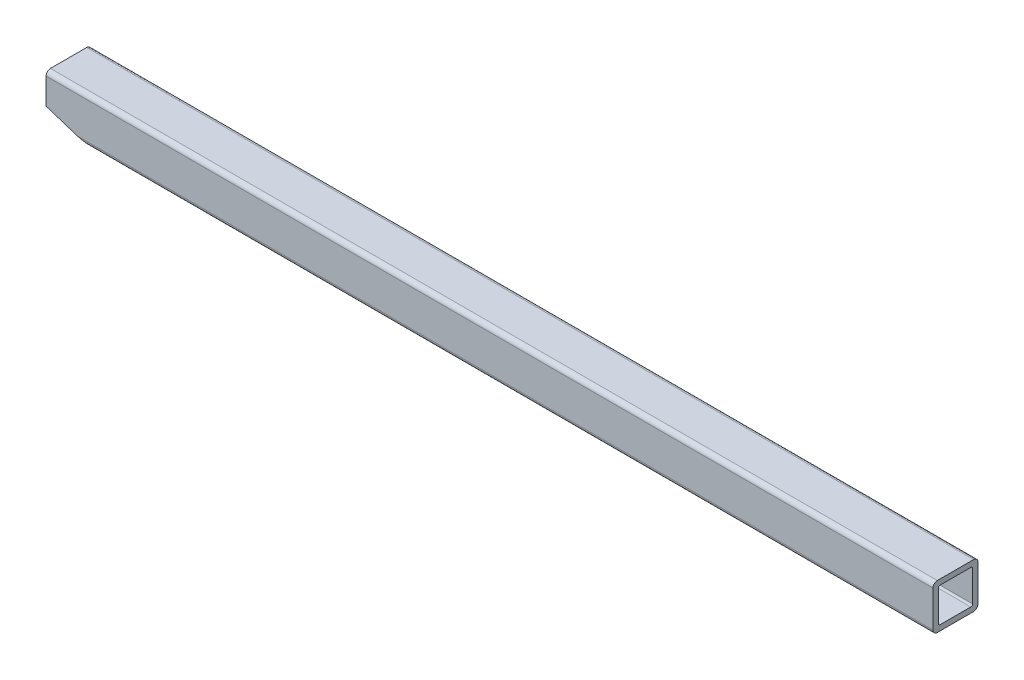
ISO-10303-21;
HEADER;
FILE_DESCRIPTION(('STEP AP214'),'2;1');
FILE_NAME('part.step','',(''),(''),'','','');
FILE_SCHEMA(('AUTOMOTIVE_DESIGN { 1 0 10303 214 1 1 1 1 }'));
ENDSEC;
DATA;
#1=APPLICATION_CONTEXT('core data for automotive mechanical design processes');
#2=APPLICATION_PROTOCOL_DEFINITION('international standard','automotive_design',2000,#1);
#3=PRODUCT_CONTEXT('',#1,'mechanical');
#4=PRODUCT('Part','Part','',(#3));
#5=PRODUCT_RELATED_PRODUCT_CATEGORY('part','',(#4));
#6=PRODUCT_DEFINITION_FORMATION('','',#4);
#7=PRODUCT_DEFINITION_CONTEXT('part definition',#1,'design');
#8=PRODUCT_DEFINITION('design','',#6,#7);
#9=PRODUCT_DEFINITION_SHAPE('','',#8);
#10=(LENGTH_UNIT() NAMED_UNIT(*) SI_UNIT(.MILLI.,.METRE.));
#11=(NAMED_UNIT(*) PLANE_ANGLE_UNIT() SI_UNIT($,.RADIAN.));
#12=(NAMED_UNIT(*) SI_UNIT($,.STERADIAN.) SOLID_ANGLE_UNIT());
#13=UNCERTAINTY_MEASURE_WITH_UNIT(LENGTH_MEASURE(1.E-05),#10,'distance_accuracy_value','');
#14=(GEOMETRIC_REPRESENTATION_CONTEXT(3) GLOBAL_UNCERTAINTY_ASSIGNED_CONTEXT((#13)) GLOBAL_UNIT_ASSIGNED_CONTEXT((#10,
#11,#12)) REPRESENTATION_CONTEXT('',''));
#15=CARTESIAN_POINT('',(0.,0.,0.));
#16=DIRECTION('',(0.,0.,1.));
#17=DIRECTION('',(1.,0.,0.));
#18=AXIS2_PLACEMENT_3D('',#15,#16,#17);
#19=CARTESIAN_POINT('',(-500.,12.7,-12.7));
#20=DIRECTION('',(0.,0.,-1.));
#21=DIRECTION('',(0.,1.,0.));
#22=AXIS2_PLACEMENT_3D('',#19,#20,#21);
#23=PLANE('',#22);
#24=DIRECTION('',(1.,0.,0.));
#25=VECTOR('',#24,1.);
#26=CARTESIAN_POINT('',(-500.,-10.2,-12.7));
#27=LINE('',#26,#25);
#28=CARTESIAN_POINT('',(0.,-10.2,-12.7));
#29=VERTEX_POINT('',#28);
#30=CARTESIAN_POINT('',(-482.303319661242,-10.2,-12.7));
#31=VERTEX_POINT('',#30);
#32=EDGE_CURVE('E182',#29,#31,#27,.F.);
#33=ORIENTED_EDGE('',*,*,#32,.T.);
#34=DIRECTION('',(0.951056516295156,-0.309016994374941,0.));
#35=VECTOR('',#34,1.);
#36=CARTESIAN_POINT('',(-49.0535735926118,-150.9713758856,-12.7));
#37=LINE('',#36,#35);
#38=CARTESIAN_POINT('',(-500.,-4.45,-12.7));
#39=VERTEX_POINT('',#38);
#40=EDGE_CURVE('E166',#39,#31,#37,.T.);
#41=ORIENTED_EDGE('',*,*,#40,.F.);
#42=DIRECTION('',(0.,1.,0.));
#43=VECTOR('',#42,1.);
#44=CARTESIAN_POINT('',(-500.,12.7,-12.7));
#45=LINE('',#44,#43);
#46=CARTESIAN_POINT('',(-500.,10.2,-12.7));
#47=VERTEX_POINT('',#46);
#48=EDGE_CURVE('E178',#39,#47,#45,.T.);
#49=ORIENTED_EDGE('',*,*,#48,.T.);
#50=DIRECTION('',(1.,0.,0.));
#51=VECTOR('',#50,1.);
#52=CARTESIAN_POINT('',(-500.,10.2,-12.7));
#53=LINE('',#52,#51);
#54=CARTESIAN_POINT('',(0.,10.2,-12.7));
#55=VERTEX_POINT('',#54);
#56=EDGE_CURVE('E230',#47,#55,#53,.T.);
#57=ORIENTED_EDGE('',*,*,#56,.T.);
#58=DIRECTION('',(0.,1.,0.));
#59=VECTOR('',#58,1.);
#60=CARTESIAN_POINT('',(0.,12.7,-12.7));
#61=LINE('',#60,#59);
#62=EDGE_CURVE('E207',#29,#55,#61,.T.);
#63=ORIENTED_EDGE('',*,*,#62,.F.);
#64=EDGE_LOOP('',(#33,#41,#49,#57,#63));
#65=FACE_BOUND('',#64,.T.);
#66=ADVANCED_FACE('F39',(#65),#23,.T.);
#67=CARTESIAN_POINT('',(-500.,-12.7,12.7));
#68=DIRECTION('',(0.,-1.,0.));
#69=DIRECTION('',(0.,0.,-1.));
#70=AXIS2_PLACEMENT_3D('',#67,#68,#69);
#71=PLANE('',#70);
#72=DIRECTION('',(1.,0.,0.));
#73=VECTOR('',#72,1.);
#74=CARTESIAN_POINT('',(-500.,-12.7,10.2));
#75=LINE('',#74,#73);
#76=CARTESIAN_POINT('',(0.,-12.7,10.2));
#77=VERTEX_POINT('',#76);
#78=CARTESIAN_POINT('',(-474.609110818304,-12.7,10.2));
#79=VERTEX_POINT('',#78);
#80=EDGE_CURVE('E206',#77,#79,#75,.F.);
#81=ORIENTED_EDGE('',*,*,#80,.T.);
#82=DIRECTION('',(0.,0.,1.));
#83=VECTOR('',#82,1.);
#84=CARTESIAN_POINT('',(-474.609110818304,-12.7,-12.7));
#85=LINE('',#84,#83);
#86=CARTESIAN_POINT('',(-474.609110818304,-12.7,-10.2));
#87=VERTEX_POINT('',#86);
#88=EDGE_CURVE('E172',#87,#79,#85,.T.);
#89=ORIENTED_EDGE('',*,*,#88,.F.);
#90=DIRECTION('',(1.,0.,0.));
#91=VECTOR('',#90,1.);
#92=CARTESIAN_POINT('',(-500.,-12.7,-10.2));
#93=LINE('',#92,#91);
#94=CARTESIAN_POINT('',(0.,-12.7,-10.2));
#95=VERTEX_POINT('',#94);
#96=EDGE_CURVE('E219',#87,#95,#93,.T.);
#97=ORIENTED_EDGE('',*,*,#96,.T.);
#98=DIRECTION('',(0.,0.,-1.));
#99=VECTOR('',#98,1.);
#100=CARTESIAN_POINT('',(0.,-12.7,12.7));
#101=LINE('',#100,#99);
#102=EDGE_CURVE('E192',#77,#95,#101,.T.);
#103=ORIENTED_EDGE('',*,*,#102,.F.);
#104=EDGE_LOOP('',(#81,#89,#97,#103));
#105=FACE_BOUND('',#104,.T.);
#106=ADVANCED_FACE('F342',(#105),#71,.T.);
#107=CARTESIAN_POINT('',(-500.,12.7,12.7));
#108=DIRECTION('',(0.,0.,1.));
#109=DIRECTION('',(0.,-1.,0.));
#110=AXIS2_PLACEMENT_3D('',#107,#108,#109);
#111=PLANE('',#110);
#112=DIRECTION('',(0.,-1.,0.));
#113=VECTOR('',#112,1.);
#114=CARTESIAN_POINT('',(-500.,12.7,12.7));
#115=LINE('',#114,#113);
#116=CARTESIAN_POINT('',(-500.,10.2,12.7));
#117=VERTEX_POINT('',#116);
#118=CARTESIAN_POINT('',(-500.,-4.45,12.7));
#119=VERTEX_POINT('',#118);
#120=EDGE_CURVE('E195',#117,#119,#115,.T.);
#121=ORIENTED_EDGE('',*,*,#120,.T.);
#122=DIRECTION('',(0.951056516295156,-0.309016994374941,0.));
#123=VECTOR('',#122,1.);
#124=CARTESIAN_POINT('',(-49.0535735926118,-150.9713758856,12.7));
#125=LINE('',#124,#123);
#126=CARTESIAN_POINT('',(-482.303319661242,-10.2,12.7));
#127=VERTEX_POINT('',#126);
#128=EDGE_CURVE('E183',#119,#127,#125,.T.);
#129=ORIENTED_EDGE('',*,*,#128,.T.);
#130=DIRECTION('',(1.,0.,0.));
#131=VECTOR('',#130,1.);
#132=CARTESIAN_POINT('',(-500.,-10.2,12.7));
#133=LINE('',#132,#131);
#134=CARTESIAN_POINT('',(0.,-10.2,12.7));
#135=VERTEX_POINT('',#134);
#136=EDGE_CURVE('E239',#127,#135,#133,.T.);
#137=ORIENTED_EDGE('',*,*,#136,.T.);
#138=DIRECTION('',(0.,-1.,0.));
#139=VECTOR('',#138,1.);
#140=CARTESIAN_POINT('',(0.,12.7,12.7));
#141=LINE('',#140,#139);
#142=CARTESIAN_POINT('',(0.,10.2,12.7));
#143=VERTEX_POINT('',#142);
#144=EDGE_CURVE('E198',#143,#135,#141,.T.);
#145=ORIENTED_EDGE('',*,*,#144,.F.);
#146=DIRECTION('',(1.,0.,0.));
#147=VECTOR('',#146,1.);
#148=CARTESIAN_POINT('',(-500.,10.2,12.7));
#149=LINE('',#148,#147);
#150=EDGE_CURVE('E237',#143,#117,#149,.F.);
#151=ORIENTED_EDGE('',*,*,#150,.T.);
#152=EDGE_LOOP('',(#121,#129,#137,#145,#151));
#153=FACE_BOUND('',#152,.T.);
#154=ADVANCED_FACE('F347',(#153),#111,.T.);
#155=CARTESIAN_POINT('',(-500.,0.,0.));
#156=DIRECTION('',(1.,0.,0.));
#157=DIRECTION('',(0.,0.,-1.));
#158=AXIS2_PLACEMENT_3D('',#155,#156,#157);
#159=PLANE('',#158);
#160=DIRECTION('',(0.,0.,1.));
#161=VECTOR('',#160,1.);
#162=CARTESIAN_POINT('',(-500.,-4.45,-12.7));
#163=LINE('',#162,#161);
#164=CARTESIAN_POINT('',(-500.,-4.45,9.65199999999999));
#165=VERTEX_POINT('',#164);
#166=EDGE_CURVE('E173',#165,#119,#163,.T.);
#167=ORIENTED_EDGE('',*,*,#166,.T.);
#168=ORIENTED_EDGE('',*,*,#120,.F.);
#169=CARTESIAN_POINT('',(-500.,10.2,10.2));
#170=DIRECTION('',(1.,0.,0.));
#171=DIRECTION('',(0.,0.,-1.));
#172=AXIS2_PLACEMENT_3D('',#169,#170,#171);
#173=CIRCLE('',#172,2.5);
#174=CARTESIAN_POINT('',(-500.,12.7,10.2));
#175=VERTEX_POINT('',#174);
#176=EDGE_CURVE('E234',#117,#175,#173,.F.);
#177=ORIENTED_EDGE('',*,*,#176,.T.);
#178=DIRECTION('',(0.,0.,1.));
#179=VECTOR('',#178,1.);
#180=CARTESIAN_POINT('',(-500.,12.7,12.7));
#181=LINE('',#180,#179);
#182=CARTESIAN_POINT('',(-500.,12.7,-10.2));
#183=VERTEX_POINT('',#182);
#184=EDGE_CURVE('E191',#183,#175,#181,.T.);
#185=ORIENTED_EDGE('',*,*,#184,.F.);
#186=CARTESIAN_POINT('',(-500.,10.2,-10.2));
#187=DIRECTION('',(1.,0.,0.));
#188=DIRECTION('',(0.,0.,-1.));
#189=AXIS2_PLACEMENT_3D('',#186,#187,#188);
#190=CIRCLE('',#189,2.5);
#191=EDGE_CURVE('E189',#183,#47,#190,.F.);
#192=ORIENTED_EDGE('',*,*,#191,.T.);
#193=ORIENTED_EDGE('',*,*,#48,.F.);
#194=CARTESIAN_POINT('',(-500.,-4.45,-9.652));
#195=VERTEX_POINT('',#194);
#196=EDGE_CURVE('E163',#39,#195,#163,.T.);
#197=ORIENTED_EDGE('',*,*,#196,.T.);
#198=DIRECTION('',(0.,1.,0.));
#199=VECTOR('',#198,1.);
#200=CARTESIAN_POINT('',(-500.,-9.652,-9.652));
#201=LINE('',#200,#199);
#202=CARTESIAN_POINT('',(-500.,8.652,-9.652));
#203=VERTEX_POINT('',#202);
#204=EDGE_CURVE('E315',#195,#203,#201,.T.);
#205=ORIENTED_EDGE('',*,*,#204,.T.);
#206=CARTESIAN_POINT('',(-500.,8.652,-8.652));
#207=DIRECTION('',(1.,0.,0.));
#208=DIRECTION('',(0.,0.,-1.));
#209=AXIS2_PLACEMENT_3D('',#206,#207,#208);
#210=CIRCLE('',#209,1.);
#211=CARTESIAN_POINT('',(-500.,9.652,-8.652));
#212=VERTEX_POINT('',#211);
#213=EDGE_CURVE('E276',#203,#212,#210,.T.);
#214=ORIENTED_EDGE('',*,*,#213,.T.);
#215=DIRECTION('',(0.,0.,1.));
#216=VECTOR('',#215,1.);
#217=CARTESIAN_POINT('',(-500.,9.652,9.652));
#218=LINE('',#217,#216);
#219=CARTESIAN_POINT('',(-500.,9.652,8.652));
#220=VERTEX_POINT('',#219);
#221=EDGE_CURVE('E317',#212,#220,#218,.T.);
#222=ORIENTED_EDGE('',*,*,#221,.T.);
#223=CARTESIAN_POINT('',(-500.,8.652,8.652));
#224=DIRECTION('',(1.,0.,0.));
#225=DIRECTION('',(0.,0.,-1.));
#226=AXIS2_PLACEMENT_3D('',#223,#224,#225);
#227=CIRCLE('',#226,1.);
#228=CARTESIAN_POINT('',(-500.,8.652,9.652));
#229=VERTEX_POINT('',#228);
#230=EDGE_CURVE('E61',#220,#229,#227,.T.);
#231=ORIENTED_EDGE('',*,*,#230,.T.);
#232=DIRECTION('',(0.,-1.,0.));
#233=VECTOR('',#232,1.);
#234=CARTESIAN_POINT('',(-500.,-9.652,9.652));
#235=LINE('',#234,#233);
#236=EDGE_CURVE('E211',#229,#165,#235,.T.);
#237=ORIENTED_EDGE('',*,*,#236,.T.);
#238=EDGE_LOOP('',(#167,#168,#177,#185,#192,#193,#197,#205,#214,#222,#231,#237));
#239=FACE_BOUND('',#238,.T.);
#240=ADVANCED_FACE('F186',(#239),#159,.F.);
#241=CARTESIAN_POINT('',(-500.,-9.652,-9.652));
#242=DIRECTION('',(0.,0.,-1.));
#243=DIRECTION('',(-1.,0.,0.));
#244=AXIS2_PLACEMENT_3D('',#241,#242,#243);
#245=PLANE('',#244);
#246=DIRECTION('',(-0.951056516295156,0.309016994374941,0.));
#247=VECTOR('',#246,1.);
#248=CARTESIAN_POINT('',(-498.471170558787,-4.94674679763075,-9.652));
#249=LINE('',#248,#247);
#250=CARTESIAN_POINT('',(-487.067573776789,-8.652,-9.652));
#251=VERTEX_POINT('',#250);
#252=EDGE_CURVE('E169',#251,#195,#249,.T.);
#253=ORIENTED_EDGE('',*,*,#252,.F.);
#254=DIRECTION('',(1.,0.,0.));
#255=VECTOR('',#254,1.);
#256=CARTESIAN_POINT('',(0.,-8.652,-9.652));
#257=LINE('',#256,#255);
#258=CARTESIAN_POINT('',(0.,-8.652,-9.652));
#259=VERTEX_POINT('',#258);
#260=EDGE_CURVE('E250',#251,#259,#257,.T.);
#261=ORIENTED_EDGE('',*,*,#260,.T.);
#262=DIRECTION('',(0.,1.,0.));
#263=VECTOR('',#262,1.);
#264=CARTESIAN_POINT('',(0.,-9.652,-9.652));
#265=LINE('',#264,#263);
#266=CARTESIAN_POINT('',(0.,8.652,-9.652));
#267=VERTEX_POINT('',#266);
#268=EDGE_CURVE('E314',#259,#267,#265,.T.);
#269=ORIENTED_EDGE('',*,*,#268,.T.);
#270=DIRECTION('',(1.,0.,0.));
#271=VECTOR('',#270,1.);
#272=CARTESIAN_POINT('',(-500.,8.652,-9.652));
#273=LINE('',#272,#271);
#274=EDGE_CURVE('E247',#267,#203,#273,.F.);
#275=ORIENTED_EDGE('',*,*,#274,.T.);
#276=ORIENTED_EDGE('',*,*,#204,.F.);
#277=EDGE_LOOP('',(#253,#261,#269,#275,#276));
#278=FACE_BOUND('',#277,.T.);
#279=ADVANCED_FACE('F378',(#278),#245,.F.);
#280=CARTESIAN_POINT('',(-500.,-9.652,9.652));
#281=DIRECTION('',(0.,-1.,0.));
#282=DIRECTION('',(0.,0.,-1.));
#283=AXIS2_PLACEMENT_3D('',#280,#281,#282);
#284=PLANE('',#283);
#285=DIRECTION('',(0.,0.,-1.));
#286=VECTOR('',#285,1.);
#287=CARTESIAN_POINT('',(-483.989890239614,-9.652,9.652));
#288=LINE('',#287,#286);
#289=CARTESIAN_POINT('',(-483.989890239614,-9.652,8.652));
#290=VERTEX_POINT('',#289);
#291=CARTESIAN_POINT('',(-483.989890239614,-9.652,-8.652));
#292=VERTEX_POINT('',#291);
#293=EDGE_CURVE('E298',#290,#292,#288,.T.);
#294=ORIENTED_EDGE('',*,*,#293,.F.);
#295=DIRECTION('',(1.,0.,0.));
#296=VECTOR('',#295,1.);
#297=CARTESIAN_POINT('',(0.,-9.652,8.652));
#298=LINE('',#297,#296);
#299=CARTESIAN_POINT('',(0.,-9.652,8.652));
#300=VERTEX_POINT('',#299);
#301=EDGE_CURVE('E253',#290,#300,#298,.T.);
#302=ORIENTED_EDGE('',*,*,#301,.T.);
#303=DIRECTION('',(0.,0.,-1.));
#304=VECTOR('',#303,1.);
#305=CARTESIAN_POINT('',(0.,-9.652,9.652));
#306=LINE('',#305,#304);
#307=CARTESIAN_POINT('',(0.,-9.652,-8.652));
#308=VERTEX_POINT('',#307);
#309=EDGE_CURVE('E201',#300,#308,#306,.T.);
#310=ORIENTED_EDGE('',*,*,#309,.T.);
#311=DIRECTION('',(1.,0.,0.));
#312=VECTOR('',#311,1.);
#313=CARTESIAN_POINT('',(-500.,-9.652,-8.652));
#314=LINE('',#313,#312);
#315=EDGE_CURVE('E256',#308,#292,#314,.F.);
#316=ORIENTED_EDGE('',*,*,#315,.T.);
#317=EDGE_LOOP('',(#294,#302,#310,#316));
#318=FACE_BOUND('',#317,.T.);
#319=ADVANCED_FACE('F301',(#318),#284,.F.);
#320=CARTESIAN_POINT('',(-500.,-9.652,9.652));
#321=DIRECTION('',(0.,0.,1.));
#322=DIRECTION('',(1.,0.,0.));
#323=AXIS2_PLACEMENT_3D('',#320,#321,#322);
#324=PLANE('',#323);
#325=DIRECTION('',(0.951056516295156,-0.309016994374941,0.));
#326=VECTOR('',#325,1.);
#327=CARTESIAN_POINT('',(-498.471170558787,-4.94674679763075,9.652));
#328=LINE('',#327,#326);
#329=CARTESIAN_POINT('',(-487.067573776789,-8.652,9.652));
#330=VERTEX_POINT('',#329);
#331=EDGE_CURVE('E53',#165,#330,#328,.T.);
#332=ORIENTED_EDGE('',*,*,#331,.F.);
#333=ORIENTED_EDGE('',*,*,#236,.F.);
#334=DIRECTION('',(1.,0.,0.));
#335=VECTOR('',#334,1.);
#336=CARTESIAN_POINT('',(0.,8.652,9.652));
#337=LINE('',#336,#335);
#338=CARTESIAN_POINT('',(0.,8.652,9.652));
#339=VERTEX_POINT('',#338);
#340=EDGE_CURVE('E269',#229,#339,#337,.T.);
#341=ORIENTED_EDGE('',*,*,#340,.T.);
#342=DIRECTION('',(0.,-1.,0.));
#343=VECTOR('',#342,1.);
#344=CARTESIAN_POINT('',(0.,-9.652,9.652));
#345=LINE('',#344,#343);
#346=CARTESIAN_POINT('',(0.,-8.652,9.652));
#347=VERTEX_POINT('',#346);
#348=EDGE_CURVE('E288',#339,#347,#345,.T.);
#349=ORIENTED_EDGE('',*,*,#348,.T.);
#350=DIRECTION('',(1.,0.,0.));
#351=VECTOR('',#350,1.);
#352=CARTESIAN_POINT('',(-500.,-8.652,9.652));
#353=LINE('',#352,#351);
#354=EDGE_CURVE('E265',#347,#330,#353,.F.);
#355=ORIENTED_EDGE('',*,*,#354,.T.);
#356=EDGE_LOOP('',(#332,#333,#341,#349,#355));
#357=FACE_BOUND('',#356,.T.);
#358=ADVANCED_FACE('F294',(#357),#324,.F.);
#359=CARTESIAN_POINT('',(-500.,-10.2,-10.2));
#360=DIRECTION('',(1.,0.,0.));
#361=DIRECTION('',(0.,0.,-1.));
#362=AXIS2_PLACEMENT_3D('',#359,#360,#361);
#363=CYLINDRICAL_SURFACE('',#362,2.5);
#364=ORIENTED_EDGE('',*,*,#96,.F.);
#365=CARTESIAN_POINT('',(-482.303319661242,-10.2,-10.2));
#366=DIRECTION('',(-0.309016994374941,-0.951056516295156,0.));
#367=DIRECTION('',(0.951056516295156,-0.309016994374941,0.));
#368=AXIS2_PLACEMENT_3D('',#365,#366,#367);
#369=ELLIPSE('',#368,8.09016994374965,2.5);
#370=EDGE_CURVE('E312',#87,#31,#369,.F.);
#371=ORIENTED_EDGE('',*,*,#370,.T.);
#372=ORIENTED_EDGE('',*,*,#32,.F.);
#373=CARTESIAN_POINT('',(0.,-10.2,-10.2));
#374=DIRECTION('',(1.,0.,0.));
#375=DIRECTION('',(0.,0.,-1.));
#376=AXIS2_PLACEMENT_3D('',#373,#374,#375);
#377=CIRCLE('',#376,2.5);
#378=EDGE_CURVE('E228',#95,#29,#377,.T.);
#379=ORIENTED_EDGE('',*,*,#378,.F.);
#380=EDGE_LOOP('',(#364,#371,#372,#379));
#381=FACE_BOUND('',#380,.T.);
#382=ADVANCED_FACE('F354',(#381),#363,.T.);
#383=CARTESIAN_POINT('',(-500.,-10.2,10.2));
#384=DIRECTION('',(1.,0.,0.));
#385=DIRECTION('',(0.,0.,-1.));
#386=AXIS2_PLACEMENT_3D('',#383,#384,#385);
#387=CYLINDRICAL_SURFACE('',#386,2.5);
#388=ORIENTED_EDGE('',*,*,#136,.F.);
#389=CARTESIAN_POINT('',(-482.303319661242,-10.2,10.2));
#390=DIRECTION('',(-0.309016994374941,-0.951056516295156,0.));
#391=DIRECTION('',(0.951056516295156,-0.309016994374941,0.));
#392=AXIS2_PLACEMENT_3D('',#389,#390,#391);
#393=ELLIPSE('',#392,8.09016994374965,2.5);
#394=EDGE_CURVE('E309',#127,#79,#393,.F.);
#395=ORIENTED_EDGE('',*,*,#394,.T.);
#396=ORIENTED_EDGE('',*,*,#80,.F.);
#397=CARTESIAN_POINT('',(0.,-10.2,10.2));
#398=DIRECTION('',(1.,0.,0.));
#399=DIRECTION('',(0.,0.,-1.));
#400=AXIS2_PLACEMENT_3D('',#397,#398,#399);
#401=CIRCLE('',#400,2.5);
#402=EDGE_CURVE('E226',#135,#77,#401,.T.);
#403=ORIENTED_EDGE('',*,*,#402,.F.);
#404=EDGE_LOOP('',(#388,#395,#396,#403));
#405=FACE_BOUND('',#404,.T.);
#406=ADVANCED_FACE('F357',(#405),#387,.T.);
#407=CARTESIAN_POINT('',(-500.,-8.652,-8.652));
#408=DIRECTION('',(-1.,0.,0.));
#409=DIRECTION('',(0.,0.,1.));
#410=AXIS2_PLACEMENT_3D('',#407,#408,#409);
#411=CYLINDRICAL_SURFACE('',#410,1.);
#412=CARTESIAN_POINT('',(-487.067573776789,-8.652,-8.652));
#413=DIRECTION('',(-0.309016994374941,-0.951056516295156,0.));
#414=DIRECTION('',(-0.951056516295156,0.309016994374941,0.));
#415=AXIS2_PLACEMENT_3D('',#412,#413,#414);
#416=ELLIPSE('',#415,3.23606797749986,1.);
#417=EDGE_CURVE('E303',#292,#251,#416,.F.);
#418=ORIENTED_EDGE('',*,*,#417,.F.);
#419=ORIENTED_EDGE('',*,*,#315,.F.);
#420=CARTESIAN_POINT('',(0.,-8.652,-8.652));
#421=DIRECTION('',(1.,0.,0.));
#422=DIRECTION('',(0.,0.,-1.));
#423=AXIS2_PLACEMENT_3D('',#420,#421,#422);
#424=CIRCLE('',#423,1.);
#425=EDGE_CURVE('E272',#259,#308,#424,.F.);
#426=ORIENTED_EDGE('',*,*,#425,.F.);
#427=ORIENTED_EDGE('',*,*,#260,.F.);
#428=EDGE_LOOP('',(#418,#419,#426,#427));
#429=FACE_BOUND('',#428,.T.);
#430=ADVANCED_FACE('F361',(#429),#411,.F.);
#431=CARTESIAN_POINT('',(-500.,-8.652,8.652));
#432=DIRECTION('',(-1.,0.,0.));
#433=DIRECTION('',(0.,0.,1.));
#434=AXIS2_PLACEMENT_3D('',#431,#432,#433);
#435=CYLINDRICAL_SURFACE('',#434,1.);
#436=CARTESIAN_POINT('',(-487.067573776789,-8.652,8.652));
#437=DIRECTION('',(-0.309016994374941,-0.951056516295156,0.));
#438=DIRECTION('',(-0.951056516295156,0.309016994374941,0.));
#439=AXIS2_PLACEMENT_3D('',#436,#437,#438);
#440=ELLIPSE('',#439,3.23606797749986,1.);
#441=EDGE_CURVE('E11',#330,#290,#440,.F.);
#442=ORIENTED_EDGE('',*,*,#441,.F.);
#443=ORIENTED_EDGE('',*,*,#354,.F.);
#444=CARTESIAN_POINT('',(0.,-8.652,8.652));
#445=DIRECTION('',(1.,0.,0.));
#446=DIRECTION('',(0.,0.,-1.));
#447=AXIS2_PLACEMENT_3D('',#444,#445,#446);
#448=CIRCLE('',#447,1.);
#449=EDGE_CURVE('E47',#300,#347,#448,.F.);
#450=ORIENTED_EDGE('',*,*,#449,.F.);
#451=ORIENTED_EDGE('',*,*,#301,.F.);
#452=EDGE_LOOP('',(#442,#443,#450,#451));
#453=FACE_BOUND('',#452,.T.);
#454=ADVANCED_FACE('F41',(#453),#435,.F.);
#455=CARTESIAN_POINT('',(-500.,12.7,12.7));
#456=DIRECTION('',(0.,1.,0.));
#457=DIRECTION('',(0.,0.,1.));
#458=AXIS2_PLACEMENT_3D('',#455,#456,#457);
#459=PLANE('',#458);
#460=DIRECTION('',(0.,0.,1.));
#461=VECTOR('',#460,1.);
#462=CARTESIAN_POINT('',(0.,12.7,12.7));
#463=LINE('',#462,#461);
#464=CARTESIAN_POINT('',(0.,12.7,-10.2));
#465=VERTEX_POINT('',#464);
#466=CARTESIAN_POINT('',(0.,12.7,10.2));
#467=VERTEX_POINT('',#466);
#468=EDGE_CURVE('E210',#465,#467,#463,.T.);
#469=ORIENTED_EDGE('',*,*,#468,.F.);
#470=DIRECTION('',(1.,0.,0.));
#471=VECTOR('',#470,1.);
#472=CARTESIAN_POINT('',(-500.,12.7,-10.2));
#473=LINE('',#472,#471);
#474=EDGE_CURVE('E245',#465,#183,#473,.F.);
#475=ORIENTED_EDGE('',*,*,#474,.T.);
#476=ORIENTED_EDGE('',*,*,#184,.T.);
#477=DIRECTION('',(1.,0.,0.));
#478=VECTOR('',#477,1.);
#479=CARTESIAN_POINT('',(-500.,12.7,10.2));
#480=LINE('',#479,#478);
#481=EDGE_CURVE('E242',#175,#467,#480,.T.);
#482=ORIENTED_EDGE('',*,*,#481,.T.);
#483=EDGE_LOOP('',(#469,#475,#476,#482));
#484=FACE_BOUND('',#483,.T.);
#485=ADVANCED_FACE('F352',(#484),#459,.T.);
#486=CARTESIAN_POINT('',(0.,0.,0.));
#487=DIRECTION('',(1.,0.,0.));
#488=DIRECTION('',(0.,0.,-1.));
#489=AXIS2_PLACEMENT_3D('',#486,#487,#488);
#490=PLANE('',#489);
#491=ORIENTED_EDGE('',*,*,#268,.F.);
#492=ORIENTED_EDGE('',*,*,#425,.T.);
#493=ORIENTED_EDGE('',*,*,#309,.F.);
#494=ORIENTED_EDGE('',*,*,#449,.T.);
#495=ORIENTED_EDGE('',*,*,#348,.F.);
#496=CARTESIAN_POINT('',(0.,8.652,8.652));
#497=DIRECTION('',(1.,0.,0.));
#498=DIRECTION('',(0.,0.,-1.));
#499=AXIS2_PLACEMENT_3D('',#496,#497,#498);
#500=CIRCLE('',#499,1.);
#501=CARTESIAN_POINT('',(0.,9.652,8.652));
#502=VERTEX_POINT('',#501);
#503=EDGE_CURVE('E278',#339,#502,#500,.F.);
#504=ORIENTED_EDGE('',*,*,#503,.T.);
#505=DIRECTION('',(0.,0.,1.));
#506=VECTOR('',#505,1.);
#507=CARTESIAN_POINT('',(0.,9.652,9.652));
#508=LINE('',#507,#506);
#509=CARTESIAN_POINT('',(0.,9.652,-8.652));
#510=VERTEX_POINT('',#509);
#511=EDGE_CURVE('E296',#510,#502,#508,.T.);
#512=ORIENTED_EDGE('',*,*,#511,.F.);
#513=CARTESIAN_POINT('',(0.,8.652,-8.652));
#514=DIRECTION('',(1.,0.,0.));
#515=DIRECTION('',(0.,0.,-1.));
#516=AXIS2_PLACEMENT_3D('',#513,#514,#515);
#517=CIRCLE('',#516,1.);
#518=EDGE_CURVE('E274',#510,#267,#517,.F.);
#519=ORIENTED_EDGE('',*,*,#518,.T.);
#520=EDGE_LOOP('',(#491,#492,#493,#494,#495,#504,#512,#519));
#521=FACE_BOUND('',#520,.T.);
#522=ORIENTED_EDGE('',*,*,#102,.T.);
#523=ORIENTED_EDGE('',*,*,#378,.T.);
#524=ORIENTED_EDGE('',*,*,#62,.T.);
#525=CARTESIAN_POINT('',(0.,10.2,-10.2));
#526=DIRECTION('',(1.,0.,0.));
#527=DIRECTION('',(0.,0.,-1.));
#528=AXIS2_PLACEMENT_3D('',#525,#526,#527);
#529=CIRCLE('',#528,2.5);
#530=EDGE_CURVE('E224',#55,#465,#529,.T.);
#531=ORIENTED_EDGE('',*,*,#530,.T.);
#532=ORIENTED_EDGE('',*,*,#468,.T.);
#533=CARTESIAN_POINT('',(0.,10.2,10.2));
#534=DIRECTION('',(1.,0.,0.));
#535=DIRECTION('',(0.,0.,-1.));
#536=AXIS2_PLACEMENT_3D('',#533,#534,#535);
#537=CIRCLE('',#536,2.5);
#538=EDGE_CURVE('E222',#467,#143,#537,.T.);
#539=ORIENTED_EDGE('',*,*,#538,.T.);
#540=ORIENTED_EDGE('',*,*,#144,.T.);
#541=ORIENTED_EDGE('',*,*,#402,.T.);
#542=EDGE_LOOP('',(#522,#523,#524,#531,#532,#539,#540,#541));
#543=FACE_BOUND('',#542,.T.);
#544=ADVANCED_FACE('F286',(#521,#543),#490,.T.);
#545=CARTESIAN_POINT('',(-500.,9.652,9.652));
#546=DIRECTION('',(0.,1.,0.));
#547=DIRECTION('',(0.,0.,1.));
#548=AXIS2_PLACEMENT_3D('',#545,#546,#547);
#549=PLANE('',#548);
#550=ORIENTED_EDGE('',*,*,#221,.F.);
#551=DIRECTION('',(1.,0.,0.));
#552=VECTOR('',#551,1.);
#553=CARTESIAN_POINT('',(0.,9.652,-8.652));
#554=LINE('',#553,#552);
#555=EDGE_CURVE('E262',#212,#510,#554,.T.);
#556=ORIENTED_EDGE('',*,*,#555,.T.);
#557=ORIENTED_EDGE('',*,*,#511,.T.);
#558=DIRECTION('',(1.,0.,0.));
#559=VECTOR('',#558,1.);
#560=CARTESIAN_POINT('',(-500.,9.652,8.652));
#561=LINE('',#560,#559);
#562=EDGE_CURVE('E260',#502,#220,#561,.F.);
#563=ORIENTED_EDGE('',*,*,#562,.T.);
#564=EDGE_LOOP('',(#550,#556,#557,#563));
#565=FACE_BOUND('',#564,.T.);
#566=ADVANCED_FACE('F327',(#565),#549,.F.);
#567=CARTESIAN_POINT('',(-500.,10.2,-10.2));
#568=DIRECTION('',(1.,0.,0.));
#569=DIRECTION('',(0.,0.,-1.));
#570=AXIS2_PLACEMENT_3D('',#567,#568,#569);
#571=CYLINDRICAL_SURFACE('',#570,2.5);
#572=ORIENTED_EDGE('',*,*,#191,.F.);
#573=ORIENTED_EDGE('',*,*,#474,.F.);
#574=ORIENTED_EDGE('',*,*,#530,.F.);
#575=ORIENTED_EDGE('',*,*,#56,.F.);
#576=EDGE_LOOP('',(#572,#573,#574,#575));
#577=FACE_BOUND('',#576,.T.);
#578=ADVANCED_FACE('F363',(#577),#571,.T.);
#579=CARTESIAN_POINT('',(-500.,10.2,10.2));
#580=DIRECTION('',(1.,0.,0.));
#581=DIRECTION('',(0.,0.,-1.));
#582=AXIS2_PLACEMENT_3D('',#579,#580,#581);
#583=CYLINDRICAL_SURFACE('',#582,2.5);
#584=ORIENTED_EDGE('',*,*,#176,.F.);
#585=ORIENTED_EDGE('',*,*,#150,.F.);
#586=ORIENTED_EDGE('',*,*,#538,.F.);
#587=ORIENTED_EDGE('',*,*,#481,.F.);
#588=EDGE_LOOP('',(#584,#585,#586,#587));
#589=FACE_BOUND('',#588,.T.);
#590=ADVANCED_FACE('F338',(#589),#583,.T.);
#591=CARTESIAN_POINT('',(-500.,8.652,-8.652));
#592=DIRECTION('',(-1.,0.,0.));
#593=DIRECTION('',(0.,0.,1.));
#594=AXIS2_PLACEMENT_3D('',#591,#592,#593);
#595=CYLINDRICAL_SURFACE('',#594,1.);
#596=ORIENTED_EDGE('',*,*,#213,.F.);
#597=ORIENTED_EDGE('',*,*,#274,.F.);
#598=ORIENTED_EDGE('',*,*,#518,.F.);
#599=ORIENTED_EDGE('',*,*,#555,.F.);
#600=EDGE_LOOP('',(#596,#597,#598,#599));
#601=FACE_BOUND('',#600,.T.);
#602=ADVANCED_FACE('F332',(#601),#595,.F.);
#603=CARTESIAN_POINT('',(-500.,8.652,8.652));
#604=DIRECTION('',(-1.,0.,0.));
#605=DIRECTION('',(0.,0.,1.));
#606=AXIS2_PLACEMENT_3D('',#603,#604,#605);
#607=CYLINDRICAL_SURFACE('',#606,1.);
#608=ORIENTED_EDGE('',*,*,#230,.F.);
#609=ORIENTED_EDGE('',*,*,#562,.F.);
#610=ORIENTED_EDGE('',*,*,#503,.F.);
#611=ORIENTED_EDGE('',*,*,#340,.F.);
#612=EDGE_LOOP('',(#608,#609,#610,#611));
#613=FACE_BOUND('',#612,.T.);
#614=ADVANCED_FACE('F330',(#613),#607,.F.);
#615=CARTESIAN_POINT('',(-49.0535735926118,-150.9713758856,-12.7));
#616=DIRECTION('',(-0.309016994374941,-0.951056516295156,0.));
#617=DIRECTION('',(0.951056516295156,-0.309016994374941,0.));
#618=AXIS2_PLACEMENT_3D('',#615,#616,#617);
#619=PLANE('',#618);
#620=ORIENTED_EDGE('',*,*,#88,.T.);
#621=ORIENTED_EDGE('',*,*,#394,.F.);
#622=ORIENTED_EDGE('',*,*,#128,.F.);
#623=ORIENTED_EDGE('',*,*,#166,.F.);
#624=ORIENTED_EDGE('',*,*,#331,.T.);
#625=ORIENTED_EDGE('',*,*,#441,.T.);
#626=ORIENTED_EDGE('',*,*,#293,.T.);
#627=ORIENTED_EDGE('',*,*,#417,.T.);
#628=ORIENTED_EDGE('',*,*,#252,.T.);
#629=ORIENTED_EDGE('',*,*,#196,.F.);
#630=ORIENTED_EDGE('',*,*,#40,.T.);
#631=ORIENTED_EDGE('',*,*,#370,.F.);
#632=EDGE_LOOP('',(#620,#621,#622,#623,#624,#625,#626,#627,#628,#629,#630,#631));
#633=FACE_BOUND('',#632,.T.);
#634=ADVANCED_FACE('F165',(#633),#619,.T.);
#635=CLOSED_SHELL('',(#66,#106,#154,#240,#279,#319,#358,#382,#406,#430,#454,#485,#544,#566,#578,
#590,#602,#614,#634));
#636=MANIFOLD_SOLID_BREP('B2',#635);
#637=ADVANCED_BREP_SHAPE_REPRESENTATION('',(#18,#636),#14);
#638=SHAPE_DEFINITION_REPRESENTATION(#9,#637);
ENDSEC;
END-ISO-10303-21;
